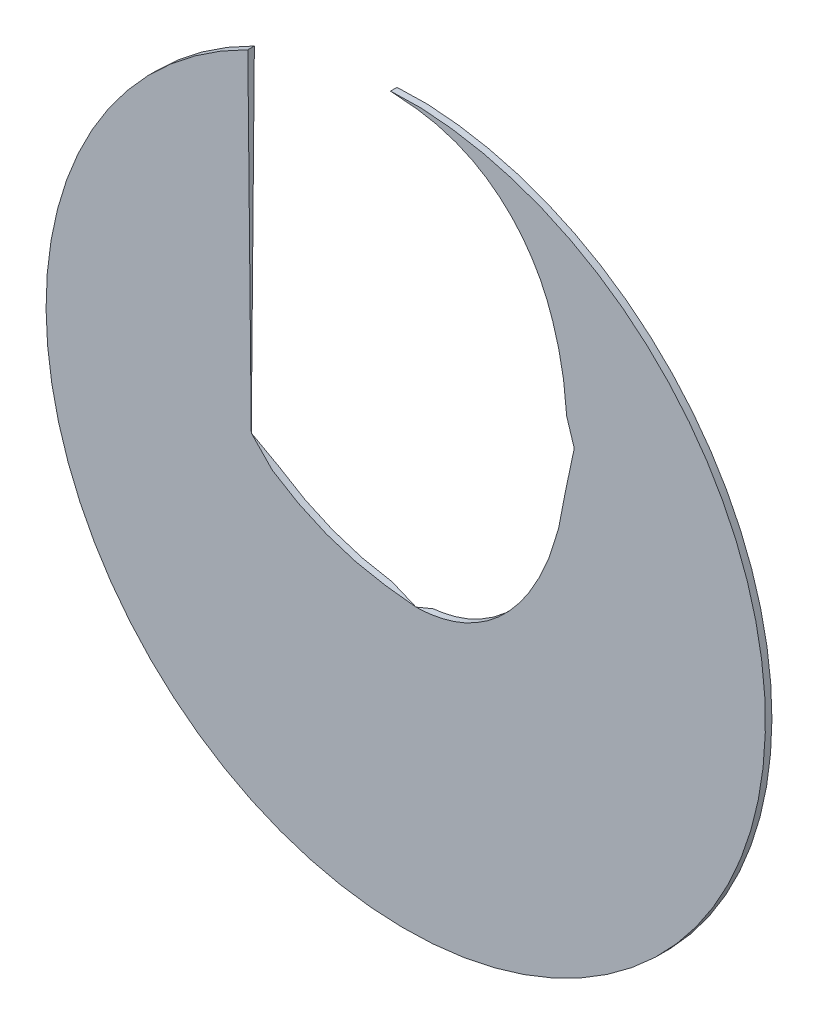
ISO-10303-21;
HEADER;
FILE_DESCRIPTION(('STEP AP214'),'2;1');
FILE_NAME('part.step','',(''),(''),'','','');
FILE_SCHEMA(('AUTOMOTIVE_DESIGN { 1 0 10303 214 1 1 1 1 }'));
ENDSEC;
DATA;
#1=APPLICATION_CONTEXT('core data for automotive mechanical design processes');
#2=APPLICATION_PROTOCOL_DEFINITION('international standard','automotive_design',2000,#1);
#3=PRODUCT_CONTEXT('',#1,'mechanical');
#4=PRODUCT('Part','Part','',(#3));
#5=PRODUCT_RELATED_PRODUCT_CATEGORY('part','',(#4));
#6=PRODUCT_DEFINITION_FORMATION('','',#4);
#7=PRODUCT_DEFINITION_CONTEXT('part definition',#1,'design');
#8=PRODUCT_DEFINITION('design','',#6,#7);
#9=PRODUCT_DEFINITION_SHAPE('','',#8);
#10=(LENGTH_UNIT() NAMED_UNIT(*) SI_UNIT(.MILLI.,.METRE.));
#11=(NAMED_UNIT(*) PLANE_ANGLE_UNIT() SI_UNIT($,.RADIAN.));
#12=(NAMED_UNIT(*) SI_UNIT($,.STERADIAN.) SOLID_ANGLE_UNIT());
#13=UNCERTAINTY_MEASURE_WITH_UNIT(LENGTH_MEASURE(1.E-05),#10,'distance_accuracy_value','');
#14=(GEOMETRIC_REPRESENTATION_CONTEXT(3) GLOBAL_UNCERTAINTY_ASSIGNED_CONTEXT((#13)) GLOBAL_UNIT_ASSIGNED_CONTEXT((#10,
#11,#12)) REPRESENTATION_CONTEXT('',''));
#15=CARTESIAN_POINT('',(0.,0.,0.));
#16=DIRECTION('',(0.,0.,1.));
#17=DIRECTION('',(1.,0.,0.));
#18=AXIS2_PLACEMENT_3D('',#15,#16,#17);
#19=CARTESIAN_POINT('',(7.790275694306,5.770102471603,0.001219414054971));
#20=DIRECTION('',(1.,0.,0.));
#21=DIRECTION('',(0.,0.,-1.));
#22=AXIS2_PLACEMENT_3D('',#19,#20,#21);
#23=SPHERICAL_SURFACE('',#22,0.08075892947717);
#24=CARTESIAN_POINT('',(7.790275694306,5.770102471603,0.));
#25=DIRECTION('',(0.,0.,1.));
#26=DIRECTION('',(1.,0.,0.));
#27=AXIS2_PLACEMENT_3D('',#24,#25,#26);
#28=CIRCLE('',#27,0.08074972272188);
#29=CARTESIAN_POINT('',(7.73741704971181,5.708985856973,0.001));
#30=VERTEX_POINT('',#29);
#31=CARTESIAN_POINT('',(7.788937932468,5.688999180256,0.002));
#32=VERTEX_POINT('',#31);
#33=EDGE_CURVE('E91',#30,#32,#28,.T.);
#34=ORIENTED_EDGE('',*,*,#33,.F.);
#35=CARTESIAN_POINT('',(7.790275694306,5.770102471603,0.002));
#36=DIRECTION('',(0.,0.,-1.));
#37=DIRECTION('',(-1.,0.,0.));
#38=AXIS2_PLACEMENT_3D('',#35,#36,#37);
#39=CIRCLE('',#38,0.08075515696153);
#40=EDGE_CURVE('E84',#32,#30,#39,.T.);
#41=ORIENTED_EDGE('',*,*,#40,.F.);
#42=EDGE_LOOP('',(#34,#41));
#43=FACE_BOUND('',#42,.T.);
#44=ADVANCED_FACE('F17',(#43),#23,.F.);
#45=CARTESIAN_POINT('',(7.8354728901853,5.75434664284065,0.002));
#46=CARTESIAN_POINT('',(7.8354728901853,5.75434664284065,0.));
#47=CARTESIAN_POINT('',(7.83547086313744,5.75404028881096,0.002));
#48=CARTESIAN_POINT('',(7.83547086313744,5.75404028881096,0.));
#49=CARTESIAN_POINT('',(7.83546883608957,5.75373393478127,0.002));
#50=CARTESIAN_POINT('',(7.83546883608957,5.75373393478127,0.));
#51=CARTESIAN_POINT('',(7.83546680904171,5.75342758075158,0.002));
#52=CARTESIAN_POINT('',(7.83546680904171,5.75342758075158,0.));
#53=CARTESIAN_POINT('',(7.83526611123358,5.72309549860423,0.002));
#54=CARTESIAN_POINT('',(7.83526611123358,5.72309549860423,0.));
#55=CARTESIAN_POINT('',(7.81929136993506,5.68959684333408,0.002));
#56=CARTESIAN_POINT('',(7.81929136993506,5.68959684333408,0.));
#57=CARTESIAN_POINT('',(7.78895111623332,5.68899943984336,0.002));
#58=CARTESIAN_POINT('',(7.78895111623332,5.68899943984336,0.));
#59=CARTESIAN_POINT('',(7.7886477136963,5.68899346580845,0.002));
#60=CARTESIAN_POINT('',(7.7886477136963,5.68899346580845,0.));
#61=CARTESIAN_POINT('',(7.78834431115929,5.68898749177355,0.002));
#62=CARTESIAN_POINT('',(7.78834431115929,5.68898749177355,0.));
#63=CARTESIAN_POINT('',(7.78804090862227,5.68898151773864,0.002));
#64=CARTESIAN_POINT('',(7.78804090862227,5.68898151773864,0.));
#65=(BOUNDED_SURFACE() B_SPLINE_SURFACE(3,1,((#45,#46),(#47,#48),(#49,#50),(#51,#52),(#53,#54),
(#55,#56),(#57,#58),(#59,#60),(#61,#62),(#63,#64)),.UNSPECIFIED.,.F.,.F.,
.F.) B_SPLINE_SURFACE_WITH_KNOTS((4,3,3,4),(2,2),(-0.0100985217162225,1.54206179378785E-08,
0.999855177484028,1.00985372910466),(0.,1.),
.UNSPECIFIED.) GEOMETRIC_REPRESENTATION_ITEM() RATIONAL_B_SPLINE_SURFACE(((1.,1.),(1.,1.),(1.,
1.),(1.,1.),(1.,1.),(1.,1.),(1.,1.),(1.,1.),(1.,1.),(1.,1.))) REPRESENTATION_ITEM('') SURFACE());
#66=CARTESIAN_POINT('',(7.835466809051,5.753427582155,0.));
#67=CARTESIAN_POINT('',(7.83545742775449,5.75209469568093,0.));
#68=CARTESIAN_POINT('',(7.83541840337019,5.7507610492183,0.));
#69=CARTESIAN_POINT('',(7.83507462392099,5.74407750681928,0.));
#70=CARTESIAN_POINT('',(7.83432343934623,5.7387406989774,0.));
#71=CARTESIAN_POINT('',(7.83249549155483,5.73092165935957,0.));
#72=CARTESIAN_POINT('',(7.83177085111447,5.72834989276613,0.));
#73=CARTESIAN_POINT('',(7.82965036228373,5.72202094314062,0.));
#74=CARTESIAN_POINT('',(7.82810001369763,5.71831251341462,0.));
#75=CARTESIAN_POINT('',(7.82468487078195,5.71181508572016,0.));
#76=CARTESIAN_POINT('',(7.8229168126511,5.70897634957489,0.));
#77=CARTESIAN_POINT('',(7.81925456442289,5.70411713596525,0.));
#78=CARTESIAN_POINT('',(7.81743485964301,5.70204000463951,0.));
#79=CARTESIAN_POINT('',(7.81193111770096,5.69680936821735,0.));
#80=CARTESIAN_POINT('',(7.80787002376379,5.69401131550561,0.));
#81=CARTESIAN_POINT('',(7.80120321944518,5.69112567824723,0.));
#82=CARTESIAN_POINT('',(7.79886901301418,5.69038193570759,0.));
#83=CARTESIAN_POINT('',(7.79400668191783,5.68933003124444,0.));
#84=CARTESIAN_POINT('',(7.79147453813854,5.6890403045571,0.));
#85=CARTESIAN_POINT('',(7.78893793246805,5.68899918025333,0.));
#86=B_SPLINE_CURVE_WITH_KNOTS('',3,(#66,#67,#68,#69,#70,#71,#72,#73,#74,#75,#76,#77,#78,#79,#80,
#81,#82,#83,#84,#85),.UNSPECIFIED.,.F.,.F.,(4,2,2,2,2,2,2,2,2,4),(0.,0.00400102354541116,
0.0200640733484977,0.0280726875800833,0.0400770416084667,0.0500624766688997,0.0583238407400489,
0.0727582596738434,0.0800654057571376,0.0876622094143952),.UNSPECIFIED.);
#87=CARTESIAN_POINT('',(7.835466809051,5.753427582155,0.));
#88=VERTEX_POINT('',#87);
#89=EDGE_CURVE('E94',#88,#32,#86,.T.);
#90=CARTESIAN_POINT('',(7.835466809051,5.753427582155,0.002));
#91=CARTESIAN_POINT('',(7.83545742775449,5.75209469568093,0.002));
#92=CARTESIAN_POINT('',(7.83541840337019,5.7507610492183,0.002));
#93=CARTESIAN_POINT('',(7.83507462392099,5.74407750681928,0.002));
#94=CARTESIAN_POINT('',(7.83432343934623,5.7387406989774,0.002));
#95=CARTESIAN_POINT('',(7.83249549155483,5.73092165935957,0.002));
#96=CARTESIAN_POINT('',(7.83177085111447,5.72834989276613,0.002));
#97=CARTESIAN_POINT('',(7.82965036228373,5.72202094314062,0.002));
#98=CARTESIAN_POINT('',(7.82810001369763,5.71831251341462,0.002));
#99=CARTESIAN_POINT('',(7.82468487078195,5.71181508572016,0.002));
#100=CARTESIAN_POINT('',(7.8229168126511,5.70897634957489,0.002));
#101=CARTESIAN_POINT('',(7.81925456442289,5.70411713596525,0.002));
#102=CARTESIAN_POINT('',(7.81743485964301,5.70204000463951,0.002));
#103=CARTESIAN_POINT('',(7.81193111770096,5.69680936821735,0.002));
#104=CARTESIAN_POINT('',(7.80787002376379,5.69401131550561,0.002));
#105=CARTESIAN_POINT('',(7.80120321944518,5.69112567824723,0.002));
#106=CARTESIAN_POINT('',(7.79886901301418,5.69038193570759,0.002));
#107=CARTESIAN_POINT('',(7.79400668191783,5.68933003124444,0.002));
#108=CARTESIAN_POINT('',(7.79147453813854,5.6890403045571,0.002));
#109=CARTESIAN_POINT('',(7.78893793246805,5.68899918025333,0.002));
#110=B_SPLINE_CURVE_WITH_KNOTS('',3,(#90,#91,#92,#93,#94,#95,#96,#97,#98,#99,#100,#101,#102,
#103,#104,#105,#106,#107,#108,#109),.UNSPECIFIED.,.F.,.F.,(4,2,2,2,2,2,2,2,2,4),(0.,
0.00400102354541116,0.0200640733484977,0.0280726875800833,0.0400770416084667,0.0500624766688997,
0.0583238407400489,0.0727582596738434,0.0800654057571376,0.0876622094143952),.UNSPECIFIED.);
#111=CARTESIAN_POINT('',(7.8235112961351,5.71006300585997,0.002));
#112=VERTEX_POINT('',#111);
#113=EDGE_CURVE('E20',#112,#32,#110,.T.);
#114=EDGE_CURVE('E86',#88,#112,#110,.T.);
#115=ORIENTED_EDGE('',*,*,#89,.T.);
#116=ORIENTED_EDGE('',*,*,#113,.F.);
#117=ORIENTED_EDGE('',*,*,#114,.F.);
#118=EDGE_LOOP('',(#115,#116,#117));
#119=FACE_BOUND('',#118,.T.);
#120=ADVANCED_FACE('F99',(#119),#65,.F.);
#121=CARTESIAN_POINT('',(7.781095122766,5.821911522542,0.002));
#122=CARTESIAN_POINT('',(7.781095122766,5.821911522542,0.));
#123=CARTESIAN_POINT('',(7.781105226,5.821911205915,0.002));
#124=CARTESIAN_POINT('',(7.781105226,5.821911205915,0.));
#125=CARTESIAN_POINT('',(7.781115329234,5.821910889288,0.002));
#126=CARTESIAN_POINT('',(7.781115329234,5.821910889288,0.));
#127=CARTESIAN_POINT('',(7.781125432468,5.821910572661,0.002));
#128=CARTESIAN_POINT('',(7.781125432468,5.821910572661,0.));
#129=CARTESIAN_POINT('',(7.783171365594,5.821846454801,0.002));
#130=CARTESIAN_POINT('',(7.783171365594,5.821846454801,0.));
#131=CARTESIAN_POINT('',(7.787179755265,5.821720835169,0.002));
#132=CARTESIAN_POINT('',(7.787179755265,5.821720835169,0.));
#133=CARTESIAN_POINT('',(7.793038222453,5.820947175404,0.002));
#134=CARTESIAN_POINT('',(7.793038222453,5.820947175404,0.));
#135=CARTESIAN_POINT('',(7.798556604583,5.819552053864,0.002));
#136=CARTESIAN_POINT('',(7.798556604583,5.819552053864,0.));
#137=CARTESIAN_POINT('',(7.803736006128,5.817621165534,0.002));
#138=CARTESIAN_POINT('',(7.803736006128,5.817621165534,0.));
#139=CARTESIAN_POINT('',(7.808569592237,5.815135841501,0.002));
#140=CARTESIAN_POINT('',(7.808569592237,5.815135841501,0.));
#141=CARTESIAN_POINT('',(7.813054836315,5.812081527514,0.002));
#142=CARTESIAN_POINT('',(7.813054836315,5.812081527514,0.));
#143=CARTESIAN_POINT('',(7.817225807196,5.808508095518,0.002));
#144=CARTESIAN_POINT('',(7.817225807196,5.808508095518,0.));
#145=CARTESIAN_POINT('',(7.821052574564,5.804385273821,0.002));
#146=CARTESIAN_POINT('',(7.821052574564,5.804385273821,0.));
#147=CARTESIAN_POINT('',(7.824444652554,5.799725978018,0.002));
#148=CARTESIAN_POINT('',(7.824444652554,5.799725978018,0.));
#149=CARTESIAN_POINT('',(7.827458753085,5.794595136209,0.002));
#150=CARTESIAN_POINT('',(7.827458753085,5.794595136209,0.));
#151=CARTESIAN_POINT('',(7.829907058946,5.788917839907,0.002));
#152=CARTESIAN_POINT('',(7.829907058946,5.788917839907,0.));
#153=CARTESIAN_POINT('',(7.831918412423,5.782753065307,0.002));
#154=CARTESIAN_POINT('',(7.831918412423,5.782753065307,0.));
#155=CARTESIAN_POINT('',(7.833560248166,5.776131921545,0.002));
#156=CARTESIAN_POINT('',(7.833560248166,5.776131921545,0.));
#157=CARTESIAN_POINT('',(7.834689209636,5.769003316515,0.002));
#158=CARTESIAN_POINT('',(7.834689209636,5.769003316515,0.));
#159=CARTESIAN_POINT('',(7.835307582973,5.76138301095,0.002));
#160=CARTESIAN_POINT('',(7.835307582973,5.76138301095,0.));
#161=CARTESIAN_POINT('',(7.835412685987,5.756131738332,0.002));
#162=CARTESIAN_POINT('',(7.835412685987,5.756131738332,0.));
#163=CARTESIAN_POINT('',(7.835466809051,5.753427582155,0.002));
#164=CARTESIAN_POINT('',(7.835466809051,5.753427582155,0.));
#165=(BOUNDED_SURFACE() B_SPLINE_SURFACE(3,1,((#121,#122),(#123,#124),(#125,#126),(#127,#128),
(#129,#130),(#131,#132),(#133,#134),(#135,#136),(#137,#138),(#139,#140),(#141,#142),(#143,#144),
(#145,#146),(#147,#148),(#149,#150),(#151,#152),(#153,#154),(#155,#156),(#157,#158),(#159,#160),
(#161,#162),(#163,#164)),.UNSPECIFIED.,.F.,.F.,.F.) B_SPLINE_SURFACE_WITH_KNOTS((4,3,1,1,1,1,1,
1,1,1,1,1,1,1,1,1,1,4),(2,2),(-0.00028093235104599,0.,0.06198463199337,0.121440215043,
0.178597690638,0.23405506568,0.288541975076,0.34282719925,0.398066126492,0.454594261922,
0.512814781341,0.572331130655,0.634484450484,0.69969319695,0.768597289167,0.840913650735,
0.918078080251,0.999999992855821),(0.,1.),
.UNSPECIFIED.) GEOMETRIC_REPRESENTATION_ITEM() RATIONAL_B_SPLINE_SURFACE(((1.,1.),(1.,1.),(1.,
1.),(1.,1.),(1.,1.),(1.,1.),(1.,1.),(1.,1.),(1.,1.),(1.,1.),(1.,1.),(1.,1.),(1.,1.),(1.,1.),(1.,
1.),(1.,1.),(1.,1.),(1.,1.),(1.,1.),(1.,1.),(1.,1.),(1.,1.))) REPRESENTATION_ITEM('') SURFACE());
#166=CARTESIAN_POINT('',(7.78013521938121,5.82194160512402,0.));
#167=CARTESIAN_POINT('',(7.78046529041014,5.82193126096968,0.));
#168=CARTESIAN_POINT('',(7.78079536143907,5.82192091681534,0.));
#169=CARTESIAN_POINT('',(7.781125432468,5.821910572661,0.));
#170=CARTESIAN_POINT('',(7.783171365594,5.821846454801,0.));
#171=CARTESIAN_POINT('',(7.787179755265,5.821720835169,0.));
#172=CARTESIAN_POINT('',(7.793038222453,5.820947175404,0.));
#173=CARTESIAN_POINT('',(7.798556604583,5.819552053864,0.));
#174=CARTESIAN_POINT('',(7.803736006128,5.817621165534,0.));
#175=CARTESIAN_POINT('',(7.808569592237,5.815135841501,0.));
#176=CARTESIAN_POINT('',(7.813054836315,5.812081527514,0.));
#177=CARTESIAN_POINT('',(7.817225807196,5.808508095518,0.));
#178=CARTESIAN_POINT('',(7.821052574564,5.804385273821,0.));
#179=CARTESIAN_POINT('',(7.824444652554,5.799725978018,0.));
#180=CARTESIAN_POINT('',(7.827458753085,5.794595136209,0.));
#181=CARTESIAN_POINT('',(7.829907058946,5.788917839907,0.));
#182=CARTESIAN_POINT('',(7.831918412423,5.782753065307,0.));
#183=CARTESIAN_POINT('',(7.833560248166,5.776131921545,0.));
#184=CARTESIAN_POINT('',(7.834689209636,5.769003316515,0.));
#185=CARTESIAN_POINT('',(7.835307582973,5.76138301095,0.));
#186=CARTESIAN_POINT('',(7.835412685987,5.756131738332,0.));
#187=CARTESIAN_POINT('',(7.835466809051,5.753427582155,0.));
#188=(BOUNDED_CURVE() B_SPLINE_CURVE(3,(#166,#167,#168,#169,#170,#171,#172,#173,#174,#175,#176,
#177,#178,#179,#180,#181,#182,#183,#184,#185,#186,#187),.UNSPECIFIED.,.F.,
.F.) B_SPLINE_CURVE_WITH_KNOTS((4,3,1,1,1,1,1,1,1,1,1,1,1,1,1,1,1,4),(-0.01,0.,0.06198463199337,
0.121440215043,0.178597690638,0.23405506568,0.288541975076,0.34282719925,0.398066126492,
0.454594261922,0.512814781341,0.572331130655,0.634484450484,0.69969319695,0.768597289167,
0.840913650735,0.918078080251,1.),
.UNSPECIFIED.) CURVE() GEOMETRIC_REPRESENTATION_ITEM() RATIONAL_B_SPLINE_CURVE((1.,1.,1.,1.,1.,
1.,1.,1.,1.,1.,1.,1.,1.,1.,1.,1.,1.,1.,1.,1.,1.,1.)) REPRESENTATION_ITEM(''));
#189=CARTESIAN_POINT('',(7.78111291581998,5.82211624243131,0.));
#190=VERTEX_POINT('',#189);
#191=EDGE_CURVE('E101',#190,#88,#188,.T.);
#192=CARTESIAN_POINT('',(7.78013521938121,5.82194160512402,0.002));
#193=CARTESIAN_POINT('',(7.78046529041014,5.82193126096968,0.002));
#194=CARTESIAN_POINT('',(7.78079536143907,5.82192091681534,0.002));
#195=CARTESIAN_POINT('',(7.781125432468,5.821910572661,0.002));
#196=CARTESIAN_POINT('',(7.783171365594,5.821846454801,0.002));
#197=CARTESIAN_POINT('',(7.787179755265,5.821720835169,0.002));
#198=CARTESIAN_POINT('',(7.793038222453,5.820947175404,0.002));
#199=CARTESIAN_POINT('',(7.798556604583,5.819552053864,0.002));
#200=CARTESIAN_POINT('',(7.803736006128,5.817621165534,0.002));
#201=CARTESIAN_POINT('',(7.808569592237,5.815135841501,0.002));
#202=CARTESIAN_POINT('',(7.813054836315,5.812081527514,0.002));
#203=CARTESIAN_POINT('',(7.817225807196,5.808508095518,0.002));
#204=CARTESIAN_POINT('',(7.821052574564,5.804385273821,0.002));
#205=CARTESIAN_POINT('',(7.824444652554,5.799725978018,0.002));
#206=CARTESIAN_POINT('',(7.827458753085,5.794595136209,0.002));
#207=CARTESIAN_POINT('',(7.829907058946,5.788917839907,0.002));
#208=CARTESIAN_POINT('',(7.831918412423,5.782753065307,0.002));
#209=CARTESIAN_POINT('',(7.833560248166,5.776131921545,0.002));
#210=CARTESIAN_POINT('',(7.834689209636,5.769003316515,0.002));
#211=CARTESIAN_POINT('',(7.835307582973,5.76138301095,0.002));
#212=CARTESIAN_POINT('',(7.835412685987,5.756131738332,0.002));
#213=CARTESIAN_POINT('',(7.835466809051,5.753427582155,0.002));
#214=(BOUNDED_CURVE() B_SPLINE_CURVE(3,(#192,#193,#194,#195,#196,#197,#198,#199,#200,#201,#202,
#203,#204,#205,#206,#207,#208,#209,#210,#211,#212,#213),.UNSPECIFIED.,.F.,
.F.) B_SPLINE_CURVE_WITH_KNOTS((4,3,1,1,1,1,1,1,1,1,1,1,1,1,1,1,1,4),(-0.01,0.,0.06198463199337,
0.121440215043,0.178597690638,0.23405506568,0.288541975076,0.34282719925,0.398066126492,
0.454594261922,0.512814781341,0.572331130655,0.634484450484,0.69969319695,0.768597289167,
0.840913650735,0.918078080251,1.),
.UNSPECIFIED.) CURVE() GEOMETRIC_REPRESENTATION_ITEM() RATIONAL_B_SPLINE_CURVE((1.,1.,1.,1.,1.,
1.,1.,1.,1.,1.,1.,1.,1.,1.,1.,1.,1.,1.,1.,1.,1.,1.)) REPRESENTATION_ITEM(''));
#215=CARTESIAN_POINT('',(7.78111385659489,5.82211602766751,0.00199999999875958));
#216=VERTEX_POINT('',#215);
#217=EDGE_CURVE('E130',#216,#88,#214,.T.);
#218=CARTESIAN_POINT('',(7.78109761417933,5.82191144446316,0.002));
#219=CARTESIAN_POINT('',(7.78109761417933,5.82191144446316,0.));
#220=(BOUNDED_CURVE() B_SPLINE_CURVE(1,(#218,#219),.UNSPECIFIED.,.F.,
.F.) B_SPLINE_CURVE_WITH_KNOTS((2,2),(0.,1.),
.UNSPECIFIED.) CURVE() GEOMETRIC_REPRESENTATION_ITEM() RATIONAL_B_SPLINE_CURVE((1.,1.)) REPRESENTATION_ITEM(''));
#221=EDGE_CURVE('E11',#216,#190,#220,.T.);
#222=ORIENTED_EDGE('',*,*,#191,.T.);
#223=ORIENTED_EDGE('',*,*,#217,.F.);
#224=ORIENTED_EDGE('',*,*,#221,.T.);
#225=EDGE_LOOP('',(#222,#223,#224));
#226=FACE_BOUND('',#225,.T.);
#227=ADVANCED_FACE('F151',(#226),#165,.F.);
#228=CARTESIAN_POINT('',(7.785787009104,5.712126084221,0.0016));
#229=DIRECTION('',(0.,0.,-1.));
#230=DIRECTION('',(-1.,0.,0.));
#231=AXIS2_PLACEMENT_3D('',#228,#229,#230);
#232=CYLINDRICAL_SURFACE('',#231,0.110294884347);
#233=CARTESIAN_POINT('',(7.785787009104,5.712126084221,0.));
#234=DIRECTION('',(0.,0.,-1.));
#235=DIRECTION('',(-1.,0.,0.));
#236=AXIS2_PLACEMENT_3D('',#233,#234,#235);
#237=CIRCLE('',#236,0.110294884347);
#238=CARTESIAN_POINT('',(7.737365543228,5.811223627862,0.));
#239=VERTEX_POINT('',#238);
#240=EDGE_CURVE('E26',#190,#239,#237,.T.);
#241=ORIENTED_EDGE('',*,*,#240,.F.);
#242=ORIENTED_EDGE('',*,*,#221,.F.);
#243=CARTESIAN_POINT('',(7.785787009104,5.712126084221,0.002));
#244=DIRECTION('',(0.,0.,-1.));
#245=DIRECTION('',(-1.,0.,0.));
#246=AXIS2_PLACEMENT_3D('',#243,#244,#245);
#247=CIRCLE('',#246,0.110294884347);
#248=CARTESIAN_POINT('',(7.737365543228,5.811223627862,0.002));
#249=VERTEX_POINT('',#248);
#250=EDGE_CURVE('E111',#216,#249,#247,.T.);
#251=ORIENTED_EDGE('',*,*,#250,.T.);
#252=DIRECTION('',(0.,0.,-1.));
#253=VECTOR('',#252,1.);
#254=CARTESIAN_POINT('',(7.737365543228,5.811223627862,0.002));
#255=LINE('',#254,#253);
#256=EDGE_CURVE('E73',#249,#239,#255,.T.);
#257=ORIENTED_EDGE('',*,*,#256,.T.);
#258=EDGE_LOOP('',(#241,#242,#251,#257));
#259=FACE_BOUND('',#258,.T.);
#260=ADVANCED_FACE('F162',(#259),#232,.T.);
#261=CARTESIAN_POINT('',(-8.84336637396,-9.035760825436,0.));
#262=DIRECTION('',(0.,0.,1.));
#263=DIRECTION('',(1.,0.,0.));
#264=AXIS2_PLACEMENT_3D('',#261,#262,#263);
#265=PLANE('',#264);
#266=ORIENTED_EDGE('',*,*,#33,.T.);
#267=ORIENTED_EDGE('',*,*,#89,.F.);
#268=ORIENTED_EDGE('',*,*,#191,.F.);
#269=ORIENTED_EDGE('',*,*,#240,.T.);
#270=DIRECTION('',(0.,1.,0.));
#271=VECTOR('',#270,1.);
#272=CARTESIAN_POINT('',(7.737365543228,-9.035760825436,0.));
#273=LINE('',#272,#271);
#274=EDGE_CURVE('E95',#30,#239,#273,.T.);
#275=ORIENTED_EDGE('',*,*,#274,.F.);
#276=EDGE_LOOP('',(#266,#267,#268,#269,#275));
#277=FACE_BOUND('',#276,.T.);
#278=ADVANCED_FACE('F92',(#277),#265,.F.);
#279=CARTESIAN_POINT('',(7.737365543228,5.665561680256,0.002));
#280=DIRECTION('',(-1.,0.,0.));
#281=DIRECTION('',(0.,0.,1.));
#282=AXIS2_PLACEMENT_3D('',#279,#280,#281);
#283=PLANE('',#282);
#284=ORIENTED_EDGE('',*,*,#274,.T.);
#285=ORIENTED_EDGE('',*,*,#256,.F.);
#286=DIRECTION('',(0.,1.,0.));
#287=VECTOR('',#286,1.);
#288=CARTESIAN_POINT('',(7.737365543228,5.665561680256,0.002));
#289=LINE('',#288,#287);
#290=EDGE_CURVE('E104',#30,#249,#289,.T.);
#291=ORIENTED_EDGE('',*,*,#290,.F.);
#292=EDGE_LOOP('',(#284,#285,#291));
#293=FACE_BOUND('',#292,.T.);
#294=ADVANCED_FACE('F196',(#293),#283,.F.);
#295=CARTESIAN_POINT('',(7.725517150591,5.608509346735,0.002));
#296=DIRECTION('',(0.,0.,-1.));
#297=DIRECTION('',(0.,-1.,0.));
#298=AXIS2_PLACEMENT_3D('',#295,#296,#297);
#299=PLANE('',#298);
#300=ORIENTED_EDGE('',*,*,#114,.T.);
#301=ORIENTED_EDGE('',*,*,#113,.T.);
#302=ORIENTED_EDGE('',*,*,#40,.T.);
#303=ORIENTED_EDGE('',*,*,#290,.T.);
#304=ORIENTED_EDGE('',*,*,#250,.F.);
#305=ORIENTED_EDGE('',*,*,#217,.T.);
#306=EDGE_LOOP('',(#300,#301,#302,#303,#304,#305));
#307=FACE_BOUND('',#306,.T.);
#308=ADVANCED_FACE('F81',(#307),#299,.F.);
#309=CLOSED_SHELL('',(#44,#120,#227,#260,#278,#294,#308));
#310=MANIFOLD_SOLID_BREP('B1',#309);
#311=ADVANCED_BREP_SHAPE_REPRESENTATION('',(#18,#310),#14);
#312=SHAPE_DEFINITION_REPRESENTATION(#9,#311);
ENDSEC;
END-ISO-10303-21;
